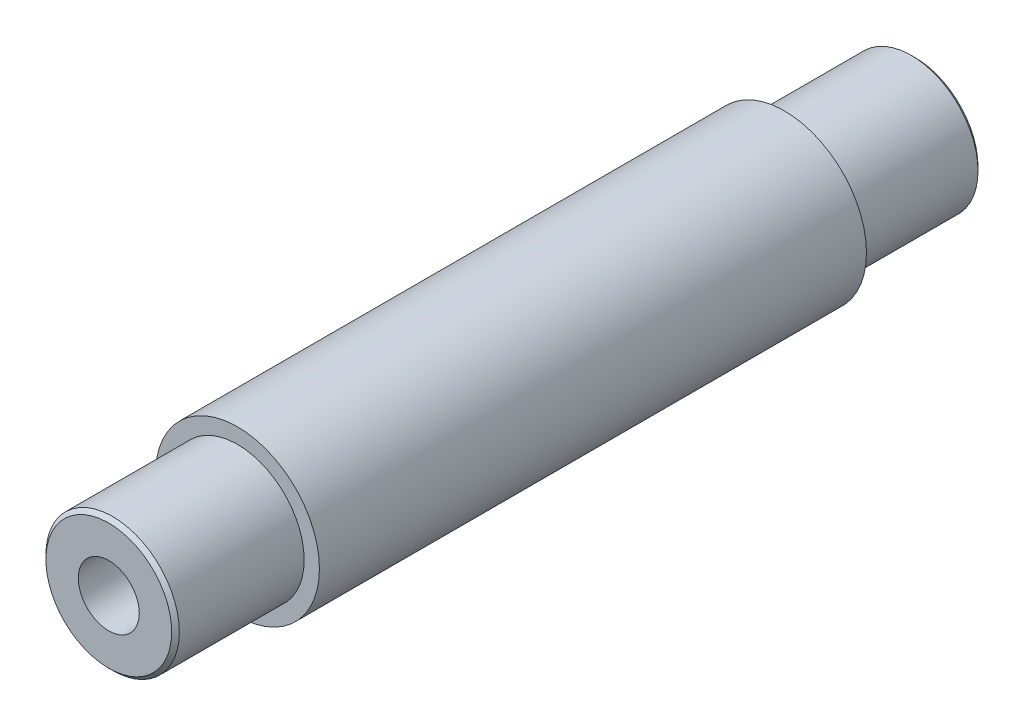
ISO-10303-21;
HEADER;
FILE_DESCRIPTION(('STEP AP214'),'2;1');
FILE_NAME('part.step','',(''),(''),'','','');
FILE_SCHEMA(('AUTOMOTIVE_DESIGN { 1 0 10303 214 1 1 1 1 }'));
ENDSEC;
DATA;
#1=APPLICATION_CONTEXT('core data for automotive mechanical design processes');
#2=APPLICATION_PROTOCOL_DEFINITION('international standard','automotive_design',2000,#1);
#3=PRODUCT_CONTEXT('',#1,'mechanical');
#4=PRODUCT('Part','Part','',(#3));
#5=PRODUCT_RELATED_PRODUCT_CATEGORY('part','',(#4));
#6=PRODUCT_DEFINITION_FORMATION('','',#4);
#7=PRODUCT_DEFINITION_CONTEXT('part definition',#1,'design');
#8=PRODUCT_DEFINITION('design','',#6,#7);
#9=PRODUCT_DEFINITION_SHAPE('','',#8);
#10=(LENGTH_UNIT() NAMED_UNIT(*) SI_UNIT(.MILLI.,.METRE.));
#11=(NAMED_UNIT(*) PLANE_ANGLE_UNIT() SI_UNIT($,.RADIAN.));
#12=(NAMED_UNIT(*) SI_UNIT($,.STERADIAN.) SOLID_ANGLE_UNIT());
#13=UNCERTAINTY_MEASURE_WITH_UNIT(LENGTH_MEASURE(1.E-05),#10,'distance_accuracy_value','');
#14=(GEOMETRIC_REPRESENTATION_CONTEXT(3) GLOBAL_UNCERTAINTY_ASSIGNED_CONTEXT((#13)) GLOBAL_UNIT_ASSIGNED_CONTEXT((#10,
#11,#12)) REPRESENTATION_CONTEXT('',''));
#15=CARTESIAN_POINT('',(0.,0.,0.));
#16=DIRECTION('',(0.,0.,1.));
#17=DIRECTION('',(1.,0.,0.));
#18=AXIS2_PLACEMENT_3D('',#15,#16,#17);
#19=CARTESIAN_POINT('',(0.,0.,20.95));
#20=DIRECTION('',(0.,0.,-1.));
#21=DIRECTION('',(1.,0.,0.));
#22=AXIS2_PLACEMENT_3D('',#19,#20,#21);
#23=CONICAL_SURFACE('',#22,3.5,0.785398163397);
#24=DIRECTION('',(-0.707106781186548,0.,0.707106781186548));
#25=VECTOR('',#24,1.);
#26=CARTESIAN_POINT('',(3.5,0.,20.95));
#27=LINE('',#26,#25);
#28=CARTESIAN_POINT('',(3.5,0.,20.95));
#29=VERTEX_POINT('',#28);
#30=CARTESIAN_POINT('',(3.3,0.,21.15));
#31=VERTEX_POINT('',#30);
#32=EDGE_CURVE('E10',#29,#31,#27,.T.);
#33=ORIENTED_EDGE('',*,*,#32,.F.);
#34=CARTESIAN_POINT('',(0.,0.,20.95));
#35=DIRECTION('',(0.,0.,1.));
#36=DIRECTION('',(1.,0.,0.));
#37=AXIS2_PLACEMENT_3D('',#34,#35,#36);
#38=CIRCLE('',#37,3.5);
#39=EDGE_CURVE('E26',#29,#29,#38,.T.);
#40=ORIENTED_EDGE('',*,*,#39,.T.);
#41=ORIENTED_EDGE('',*,*,#32,.T.);
#42=CARTESIAN_POINT('',(0.,0.,21.15));
#43=DIRECTION('',(0.,0.,1.));
#44=DIRECTION('',(1.,0.,0.));
#45=AXIS2_PLACEMENT_3D('',#42,#43,#44);
#46=CIRCLE('',#45,3.3);
#47=EDGE_CURVE('E115',#31,#31,#46,.T.);
#48=ORIENTED_EDGE('',*,*,#47,.F.);
#49=EDGE_LOOP('',(#33,#40,#41,#48));
#50=FACE_BOUND('',#49,.T.);
#51=ADVANCED_FACE('F15',(#50),#23,.T.);
#52=CARTESIAN_POINT('',(0.,0.,-21.15));
#53=DIRECTION('',(0.,0.,1.));
#54=DIRECTION('',(1.,0.,0.));
#55=AXIS2_PLACEMENT_3D('',#52,#53,#54);
#56=CYLINDRICAL_SURFACE('',#55,3.5);
#57=CARTESIAN_POINT('',(0.,0.,14.4));
#58=DIRECTION('',(0.,0.,1.));
#59=DIRECTION('',(1.,0.,0.));
#60=AXIS2_PLACEMENT_3D('',#57,#58,#59);
#61=CIRCLE('',#60,3.5);
#62=CARTESIAN_POINT('',(3.5,0.,14.4));
#63=VERTEX_POINT('',#62);
#64=EDGE_CURVE('E118',#63,#63,#61,.T.);
#65=ORIENTED_EDGE('',*,*,#64,.T.);
#66=DIRECTION('',(0.,0.,1.));
#67=VECTOR('',#66,1.);
#68=CARTESIAN_POINT('',(3.5,0.,-21.15));
#69=LINE('',#68,#67);
#70=EDGE_CURVE('E117',#63,#29,#69,.T.);
#71=ORIENTED_EDGE('',*,*,#70,.T.);
#72=ORIENTED_EDGE('',*,*,#39,.F.);
#73=ORIENTED_EDGE('',*,*,#70,.F.);
#74=EDGE_LOOP('',(#65,#71,#72,#73));
#75=FACE_BOUND('',#74,.T.);
#76=ADVANCED_FACE('F17',(#75),#56,.T.);
#77=CARTESIAN_POINT('',(0.,0.,21.15));
#78=DIRECTION('',(0.,0.,1.));
#79=DIRECTION('',(1.,0.,0.));
#80=AXIS2_PLACEMENT_3D('',#77,#78,#79);
#81=PLANE('',#80);
#82=CARTESIAN_POINT('',(0.,0.,21.15));
#83=DIRECTION('',(0.,0.,1.));
#84=DIRECTION('',(1.,0.,0.));
#85=AXIS2_PLACEMENT_3D('',#82,#83,#84);
#86=CIRCLE('',#85,1.6);
#87=CARTESIAN_POINT('',(1.6,0.,21.15));
#88=VERTEX_POINT('',#87);
#89=EDGE_CURVE('E59',#88,#88,#86,.T.);
#90=ORIENTED_EDGE('',*,*,#89,.F.);
#91=EDGE_LOOP('',(#90));
#92=FACE_BOUND('',#91,.T.);
#93=ORIENTED_EDGE('',*,*,#47,.T.);
#94=EDGE_LOOP('',(#93));
#95=FACE_BOUND('',#94,.T.);
#96=ADVANCED_FACE('F144',(#92,#95),#81,.T.);
#97=CARTESIAN_POINT('',(0.,0.,14.4));
#98=DIRECTION('',(0.,0.,1.));
#99=DIRECTION('',(1.,0.,0.));
#100=AXIS2_PLACEMENT_3D('',#97,#98,#99);
#101=PLANE('',#100);
#102=ORIENTED_EDGE('',*,*,#64,.F.);
#103=EDGE_LOOP('',(#102));
#104=FACE_BOUND('',#103,.T.);
#105=CARTESIAN_POINT('',(0.,0.,14.4));
#106=DIRECTION('',(0.,0.,1.));
#107=DIRECTION('',(1.,0.,0.));
#108=AXIS2_PLACEMENT_3D('',#105,#106,#107);
#109=CIRCLE('',#108,4.3);
#110=CARTESIAN_POINT('',(4.3,0.,14.4));
#111=VERTEX_POINT('',#110);
#112=EDGE_CURVE('E123',#111,#111,#109,.T.);
#113=ORIENTED_EDGE('',*,*,#112,.T.);
#114=EDGE_LOOP('',(#113));
#115=FACE_BOUND('',#114,.T.);
#116=ADVANCED_FACE('F136',(#104,#115),#101,.T.);
#117=CARTESIAN_POINT('',(0.,0.,-22.15));
#118=DIRECTION('',(0.,0.,1.));
#119=DIRECTION('',(1.,0.,0.));
#120=AXIS2_PLACEMENT_3D('',#117,#118,#119);
#121=CYLINDRICAL_SURFACE('',#120,1.6);
#122=DIRECTION('',(0.,0.,1.));
#123=VECTOR('',#122,1.);
#124=CARTESIAN_POINT('',(1.6,0.,-22.15));
#125=LINE('',#124,#123);
#126=CARTESIAN_POINT('',(1.6,0.,-21.15));
#127=VERTEX_POINT('',#126);
#128=EDGE_CURVE('E79',#127,#88,#125,.T.);
#129=ORIENTED_EDGE('',*,*,#128,.F.);
#130=CARTESIAN_POINT('',(0.,0.,-21.15));
#131=DIRECTION('',(0.,0.,1.));
#132=DIRECTION('',(1.,0.,0.));
#133=AXIS2_PLACEMENT_3D('',#130,#131,#132);
#134=CIRCLE('',#133,1.6);
#135=EDGE_CURVE('E121',#127,#127,#134,.T.);
#136=ORIENTED_EDGE('',*,*,#135,.F.);
#137=ORIENTED_EDGE('',*,*,#128,.T.);
#138=ORIENTED_EDGE('',*,*,#89,.T.);
#139=EDGE_LOOP('',(#129,#136,#137,#138));
#140=FACE_BOUND('',#139,.T.);
#141=ADVANCED_FACE('F133',(#140),#121,.F.);
#142=CARTESIAN_POINT('',(0.,0.,-14.3));
#143=DIRECTION('',(0.,0.,1.));
#144=DIRECTION('',(1.,0.,0.));
#145=AXIS2_PLACEMENT_3D('',#142,#143,#144);
#146=CYLINDRICAL_SURFACE('',#145,4.3);
#147=ORIENTED_EDGE('',*,*,#112,.F.);
#148=DIRECTION('',(0.,0.,1.));
#149=VECTOR('',#148,1.);
#150=CARTESIAN_POINT('',(4.3,0.,-14.3));
#151=LINE('',#150,#149);
#152=CARTESIAN_POINT('',(4.3,0.,-14.3));
#153=VERTEX_POINT('',#152);
#154=EDGE_CURVE('E71',#153,#111,#151,.T.);
#155=ORIENTED_EDGE('',*,*,#154,.F.);
#156=CARTESIAN_POINT('',(0.,0.,-14.3));
#157=DIRECTION('',(0.,0.,1.));
#158=DIRECTION('',(1.,0.,0.));
#159=AXIS2_PLACEMENT_3D('',#156,#157,#158);
#160=CIRCLE('',#159,4.3);
#161=EDGE_CURVE('E95',#153,#153,#160,.T.);
#162=ORIENTED_EDGE('',*,*,#161,.T.);
#163=ORIENTED_EDGE('',*,*,#154,.T.);
#164=EDGE_LOOP('',(#147,#155,#162,#163));
#165=FACE_BOUND('',#164,.T.);
#166=ADVANCED_FACE('F135',(#165),#146,.T.);
#167=CARTESIAN_POINT('',(0.,0.,-21.15));
#168=DIRECTION('',(0.,0.,1.));
#169=DIRECTION('',(1.,0.,0.));
#170=AXIS2_PLACEMENT_3D('',#167,#168,#169);
#171=PLANE('',#170);
#172=ORIENTED_EDGE('',*,*,#135,.T.);
#173=EDGE_LOOP('',(#172));
#174=FACE_BOUND('',#173,.T.);
#175=CARTESIAN_POINT('',(0.,0.,-21.15));
#176=DIRECTION('',(0.,0.,1.));
#177=DIRECTION('',(1.,0.,0.));
#178=AXIS2_PLACEMENT_3D('',#175,#176,#177);
#179=CIRCLE('',#178,3.3);
#180=CARTESIAN_POINT('',(3.3,0.,-21.15));
#181=VERTEX_POINT('',#180);
#182=EDGE_CURVE('E19',#181,#181,#179,.T.);
#183=ORIENTED_EDGE('',*,*,#182,.F.);
#184=EDGE_LOOP('',(#183));
#185=FACE_BOUND('',#184,.T.);
#186=ADVANCED_FACE('F131',(#174,#185),#171,.F.);
#187=CARTESIAN_POINT('',(0.,0.,-14.3));
#188=DIRECTION('',(0.,0.,1.));
#189=DIRECTION('',(1.,0.,0.));
#190=AXIS2_PLACEMENT_3D('',#187,#188,#189);
#191=PLANE('',#190);
#192=CARTESIAN_POINT('',(0.,0.,-14.3));
#193=DIRECTION('',(0.,0.,1.));
#194=DIRECTION('',(1.,0.,0.));
#195=AXIS2_PLACEMENT_3D('',#192,#193,#194);
#196=CIRCLE('',#195,3.5);
#197=CARTESIAN_POINT('',(3.5,0.,-14.3));
#198=VERTEX_POINT('',#197);
#199=EDGE_CURVE('E102',#198,#198,#196,.T.);
#200=ORIENTED_EDGE('',*,*,#199,.T.);
#201=EDGE_LOOP('',(#200));
#202=FACE_BOUND('',#201,.T.);
#203=ORIENTED_EDGE('',*,*,#161,.F.);
#204=EDGE_LOOP('',(#203));
#205=FACE_BOUND('',#204,.T.);
#206=ADVANCED_FACE('F154',(#202,#205),#191,.F.);
#207=CARTESIAN_POINT('',(0.,0.,-20.95));
#208=DIRECTION('',(0.,0.,1.));
#209=DIRECTION('',(1.,0.,0.));
#210=AXIS2_PLACEMENT_3D('',#207,#208,#209);
#211=CONICAL_SURFACE('',#210,3.5,0.785398163397);
#212=ORIENTED_EDGE('',*,*,#182,.T.);
#213=DIRECTION('',(-0.707106781186548,0.,-0.707106781186548));
#214=VECTOR('',#213,1.);
#215=CARTESIAN_POINT('',(3.5,0.,-20.95));
#216=LINE('',#215,#214);
#217=CARTESIAN_POINT('',(3.5,0.,-20.95));
#218=VERTEX_POINT('',#217);
#219=EDGE_CURVE('E88',#218,#181,#216,.T.);
#220=ORIENTED_EDGE('',*,*,#219,.F.);
#221=CARTESIAN_POINT('',(0.,0.,-20.95));
#222=DIRECTION('',(0.,0.,1.));
#223=DIRECTION('',(1.,0.,0.));
#224=AXIS2_PLACEMENT_3D('',#221,#222,#223);
#225=CIRCLE('',#224,3.5);
#226=EDGE_CURVE('E92',#218,#218,#225,.T.);
#227=ORIENTED_EDGE('',*,*,#226,.F.);
#228=ORIENTED_EDGE('',*,*,#219,.T.);
#229=EDGE_LOOP('',(#212,#220,#227,#228));
#230=FACE_BOUND('',#229,.T.);
#231=ADVANCED_FACE('F90',(#230),#211,.T.);
#232=CARTESIAN_POINT('',(0.,0.,-21.15));
#233=DIRECTION('',(0.,0.,1.));
#234=DIRECTION('',(1.,0.,0.));
#235=AXIS2_PLACEMENT_3D('',#232,#233,#234);
#236=CYLINDRICAL_SURFACE('',#235,3.5);
#237=ORIENTED_EDGE('',*,*,#226,.T.);
#238=DIRECTION('',(0.,0.,1.));
#239=VECTOR('',#238,1.);
#240=CARTESIAN_POINT('',(3.5,0.,-21.15));
#241=LINE('',#240,#239);
#242=EDGE_CURVE('E100',#218,#198,#241,.T.);
#243=ORIENTED_EDGE('',*,*,#242,.T.);
#244=ORIENTED_EDGE('',*,*,#199,.F.);
#245=ORIENTED_EDGE('',*,*,#242,.F.);
#246=EDGE_LOOP('',(#237,#243,#244,#245));
#247=FACE_BOUND('',#246,.T.);
#248=ADVANCED_FACE('F101',(#247),#236,.T.);
#249=CLOSED_SHELL('',(#51,#76,#96,#116,#141,#166,#186,#206,#231,#248));
#250=MANIFOLD_SOLID_BREP('B1',#249);
#251=ADVANCED_BREP_SHAPE_REPRESENTATION('',(#18,#250),#14);
#252=SHAPE_DEFINITION_REPRESENTATION(#9,#251);
ENDSEC;
END-ISO-10303-21;
